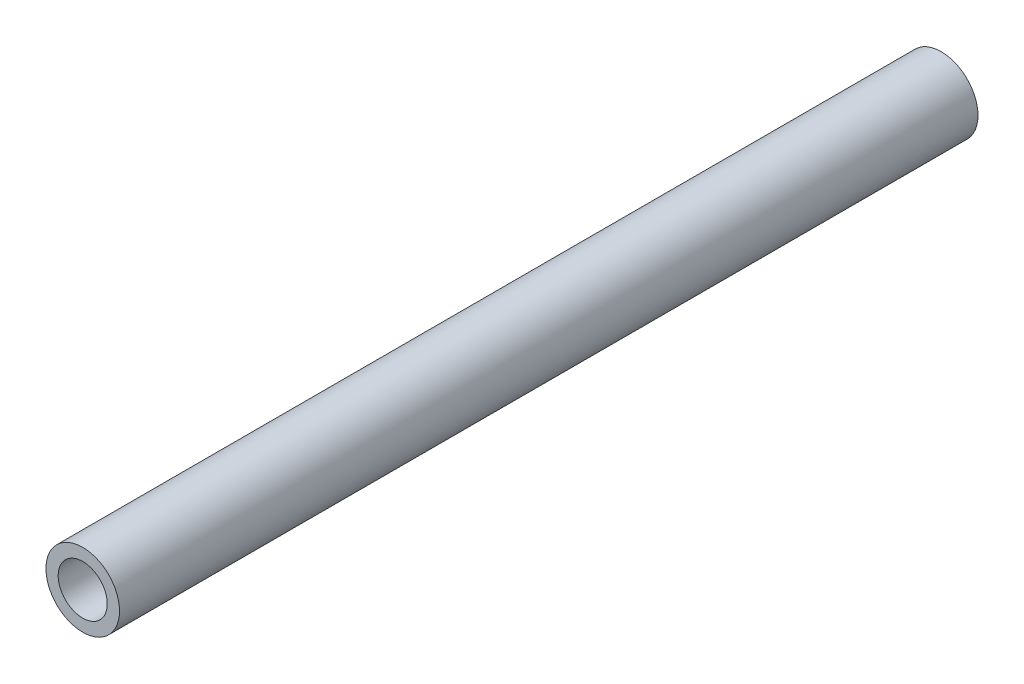
ISO-10303-21;
HEADER;
FILE_DESCRIPTION(('STEP AP214'),'2;1');
FILE_NAME('part.step','',(''),(''),'','','');
FILE_SCHEMA(('AUTOMOTIVE_DESIGN { 1 0 10303 214 1 1 1 1 }'));
ENDSEC;
DATA;
#1=APPLICATION_CONTEXT('core data for automotive mechanical design processes');
#2=APPLICATION_PROTOCOL_DEFINITION('international standard','automotive_design',2000,#1);
#3=PRODUCT_CONTEXT('',#1,'mechanical');
#4=PRODUCT('Part','Part','',(#3));
#5=PRODUCT_RELATED_PRODUCT_CATEGORY('part','',(#4));
#6=PRODUCT_DEFINITION_FORMATION('','',#4);
#7=PRODUCT_DEFINITION_CONTEXT('part definition',#1,'design');
#8=PRODUCT_DEFINITION('design','',#6,#7);
#9=PRODUCT_DEFINITION_SHAPE('','',#8);
#10=(LENGTH_UNIT() NAMED_UNIT(*) SI_UNIT(.MILLI.,.METRE.));
#11=(NAMED_UNIT(*) PLANE_ANGLE_UNIT() SI_UNIT($,.RADIAN.));
#12=(NAMED_UNIT(*) SI_UNIT($,.STERADIAN.) SOLID_ANGLE_UNIT());
#13=UNCERTAINTY_MEASURE_WITH_UNIT(LENGTH_MEASURE(1.E-05),#10,'distance_accuracy_value','');
#14=(GEOMETRIC_REPRESENTATION_CONTEXT(3) GLOBAL_UNCERTAINTY_ASSIGNED_CONTEXT((#13)) GLOBAL_UNIT_ASSIGNED_CONTEXT((#10,
#11,#12)) REPRESENTATION_CONTEXT('',''));
#15=CARTESIAN_POINT('',(0.,0.,0.));
#16=DIRECTION('',(0.,0.,1.));
#17=DIRECTION('',(1.,0.,0.));
#18=AXIS2_PLACEMENT_3D('',#15,#16,#17);
#19=CARTESIAN_POINT('',(0.,0.,70.));
#20=DIRECTION('',(0.,0.,-1.));
#21=DIRECTION('',(-1.,0.,0.));
#22=AXIS2_PLACEMENT_3D('',#19,#20,#21);
#23=CYLINDRICAL_SURFACE('',#22,3.);
#24=CARTESIAN_POINT('',(0.,0.,70.));
#25=DIRECTION('',(0.,0.,1.));
#26=DIRECTION('',(1.,0.,0.));
#27=AXIS2_PLACEMENT_3D('',#24,#25,#26);
#28=CIRCLE('',#27,3.);
#29=CARTESIAN_POINT('',(3.,0.,70.));
#30=VERTEX_POINT('',#29);
#31=EDGE_CURVE('E10',#30,#30,#28,.T.);
#32=ORIENTED_EDGE('',*,*,#31,.F.);
#33=EDGE_LOOP('',(#32));
#34=FACE_BOUND('',#33,.T.);
#35=CARTESIAN_POINT('',(0.,0.,0.));
#36=DIRECTION('',(0.,0.,1.));
#37=DIRECTION('',(1.,0.,0.));
#38=AXIS2_PLACEMENT_3D('',#35,#36,#37);
#39=CIRCLE('',#38,3.);
#40=CARTESIAN_POINT('',(3.,0.,0.));
#41=VERTEX_POINT('',#40);
#42=EDGE_CURVE('E46',#41,#41,#39,.T.);
#43=ORIENTED_EDGE('',*,*,#42,.T.);
#44=EDGE_LOOP('',(#43));
#45=FACE_BOUND('',#44,.T.);
#46=ADVANCED_FACE('F43',(#34,#45),#23,.T.);
#47=CARTESIAN_POINT('',(0.,0.,70.));
#48=DIRECTION('',(0.,0.,1.));
#49=DIRECTION('',(1.,0.,0.));
#50=AXIS2_PLACEMENT_3D('',#47,#48,#49);
#51=PLANE('',#50);
#52=CARTESIAN_POINT('',(0.,0.,70.));
#53=DIRECTION('',(0.,0.,1.));
#54=DIRECTION('',(1.,0.,0.));
#55=AXIS2_PLACEMENT_3D('',#52,#53,#54);
#56=CIRCLE('',#55,2.);
#57=CARTESIAN_POINT('',(2.,0.,70.));
#58=VERTEX_POINT('',#57);
#59=EDGE_CURVE('E57',#58,#58,#56,.T.);
#60=ORIENTED_EDGE('',*,*,#59,.F.);
#61=EDGE_LOOP('',(#60));
#62=FACE_BOUND('',#61,.T.);
#63=ORIENTED_EDGE('',*,*,#31,.T.);
#64=EDGE_LOOP('',(#63));
#65=FACE_BOUND('',#64,.T.);
#66=ADVANCED_FACE('F86',(#62,#65),#51,.T.);
#67=CARTESIAN_POINT('',(0.,0.,0.));
#68=DIRECTION('',(0.,0.,1.));
#69=DIRECTION('',(1.,0.,0.));
#70=AXIS2_PLACEMENT_3D('',#67,#68,#69);
#71=PLANE('',#70);
#72=CARTESIAN_POINT('',(0.,0.,0.));
#73=DIRECTION('',(0.,0.,-1.));
#74=DIRECTION('',(-1.,0.,0.));
#75=AXIS2_PLACEMENT_3D('',#72,#73,#74);
#76=CIRCLE('',#75,2.);
#77=CARTESIAN_POINT('',(-2.,0.,0.));
#78=VERTEX_POINT('',#77);
#79=EDGE_CURVE('E65',#78,#78,#76,.T.);
#80=ORIENTED_EDGE('',*,*,#79,.F.);
#81=EDGE_LOOP('',(#80));
#82=FACE_BOUND('',#81,.T.);
#83=ORIENTED_EDGE('',*,*,#42,.F.);
#84=EDGE_LOOP('',(#83));
#85=FACE_BOUND('',#84,.T.);
#86=ADVANCED_FACE('F82',(#82,#85),#71,.F.);
#87=CARTESIAN_POINT('',(0.,0.,63.));
#88=DIRECTION('',(0.,0.,1.));
#89=DIRECTION('',(1.,0.,0.));
#90=AXIS2_PLACEMENT_3D('',#87,#88,#89);
#91=CYLINDRICAL_SURFACE('',#90,2.);
#92=CARTESIAN_POINT('',(0.,0.,63.));
#93=DIRECTION('',(0.,0.,1.));
#94=DIRECTION('',(1.,0.,0.));
#95=AXIS2_PLACEMENT_3D('',#92,#93,#94);
#96=CIRCLE('',#95,2.);
#97=CARTESIAN_POINT('',(2.,0.,63.));
#98=VERTEX_POINT('',#97);
#99=EDGE_CURVE('E55',#98,#98,#96,.T.);
#100=ORIENTED_EDGE('',*,*,#99,.F.);
#101=EDGE_LOOP('',(#100));
#102=FACE_BOUND('',#101,.T.);
#103=ORIENTED_EDGE('',*,*,#59,.T.);
#104=EDGE_LOOP('',(#103));
#105=FACE_BOUND('',#104,.T.);
#106=ADVANCED_FACE('F85',(#102,#105),#91,.F.);
#107=CARTESIAN_POINT('',(0.,0.,63.));
#108=DIRECTION('',(0.,0.,1.));
#109=DIRECTION('',(1.,0.,0.));
#110=AXIS2_PLACEMENT_3D('',#107,#108,#109);
#111=PLANE('',#110);
#112=ORIENTED_EDGE('',*,*,#99,.T.);
#113=EDGE_LOOP('',(#112));
#114=FACE_BOUND('',#113,.T.);
#115=ADVANCED_FACE('F78',(#114),#111,.T.);
#116=CARTESIAN_POINT('',(0.,0.,7.));
#117=DIRECTION('',(0.,0.,-1.));
#118=DIRECTION('',(-1.,0.,0.));
#119=AXIS2_PLACEMENT_3D('',#116,#117,#118);
#120=CYLINDRICAL_SURFACE('',#119,2.);
#121=CARTESIAN_POINT('',(0.,0.,7.));
#122=DIRECTION('',(0.,0.,-1.));
#123=DIRECTION('',(-1.,0.,0.));
#124=AXIS2_PLACEMENT_3D('',#121,#122,#123);
#125=CIRCLE('',#124,2.);
#126=CARTESIAN_POINT('',(-2.,0.,7.));
#127=VERTEX_POINT('',#126);
#128=EDGE_CURVE('E61',#127,#127,#125,.T.);
#129=ORIENTED_EDGE('',*,*,#128,.F.);
#130=EDGE_LOOP('',(#129));
#131=FACE_BOUND('',#130,.T.);
#132=ORIENTED_EDGE('',*,*,#79,.T.);
#133=EDGE_LOOP('',(#132));
#134=FACE_BOUND('',#133,.T.);
#135=ADVANCED_FACE('F75',(#131,#134),#120,.F.);
#136=CARTESIAN_POINT('',(0.,0.,7.));
#137=DIRECTION('',(0.,0.,-1.));
#138=DIRECTION('',(-1.,0.,0.));
#139=AXIS2_PLACEMENT_3D('',#136,#137,#138);
#140=PLANE('',#139);
#141=ORIENTED_EDGE('',*,*,#128,.T.);
#142=EDGE_LOOP('',(#141));
#143=FACE_BOUND('',#142,.T.);
#144=ADVANCED_FACE('F73',(#143),#140,.T.);
#145=CLOSED_SHELL('',(#46,#66,#86,#106,#115,#135,#144));
#146=MANIFOLD_SOLID_BREP('B2',#145);
#147=ADVANCED_BREP_SHAPE_REPRESENTATION('',(#18,#146),#14);
#148=SHAPE_DEFINITION_REPRESENTATION(#9,#147);
ENDSEC;
END-ISO-10303-21;
